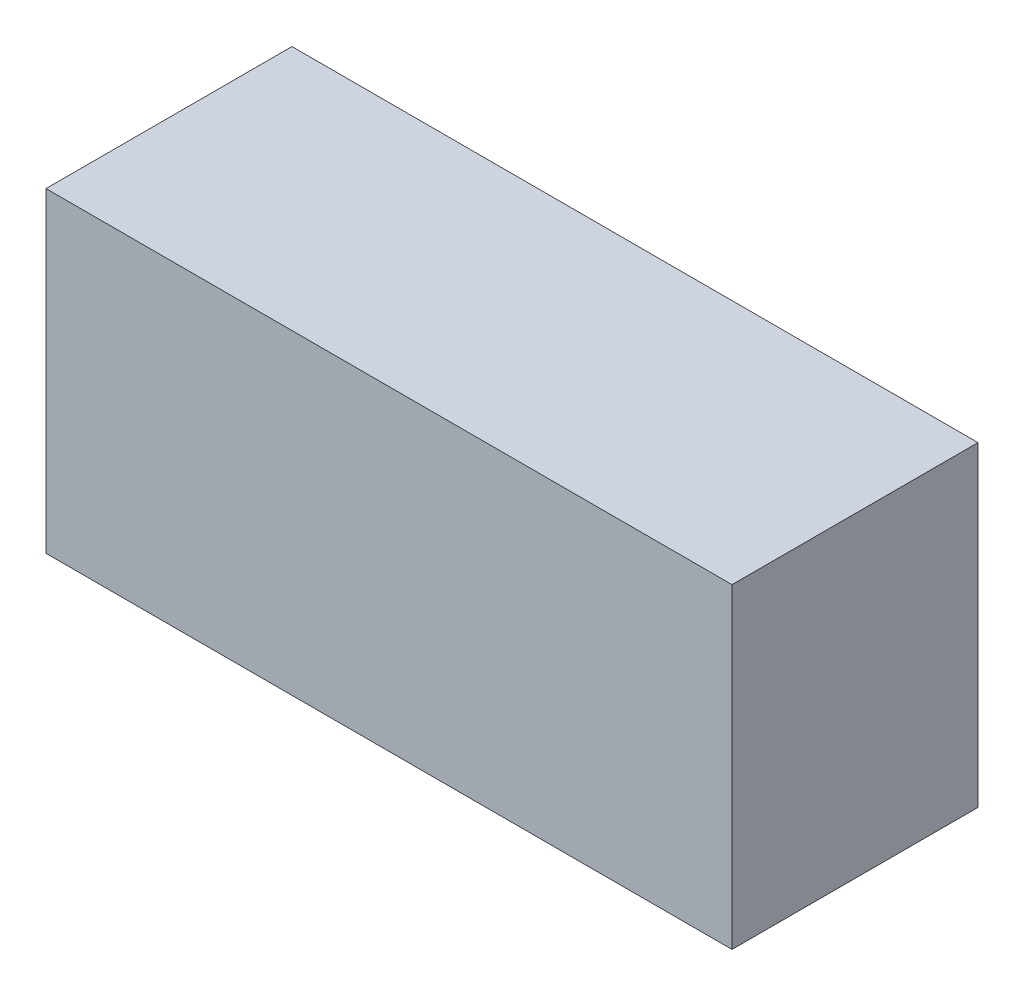
ISO-10303-21;
HEADER;
FILE_DESCRIPTION(('STEP AP214'),'2;1');
FILE_NAME('part.step','',(''),(''),'','','');
FILE_SCHEMA(('AUTOMOTIVE_DESIGN { 1 0 10303 214 1 1 1 1 }'));
ENDSEC;
DATA;
#1=APPLICATION_CONTEXT('core data for automotive mechanical design processes');
#2=APPLICATION_PROTOCOL_DEFINITION('international standard','automotive_design',2000,#1);
#3=PRODUCT_CONTEXT('',#1,'mechanical');
#4=PRODUCT('Part','Part','',(#3));
#5=PRODUCT_RELATED_PRODUCT_CATEGORY('part','',(#4));
#6=PRODUCT_DEFINITION_FORMATION('','',#4);
#7=PRODUCT_DEFINITION_CONTEXT('part definition',#1,'design');
#8=PRODUCT_DEFINITION('design','',#6,#7);
#9=PRODUCT_DEFINITION_SHAPE('','',#8);
#10=(LENGTH_UNIT() NAMED_UNIT(*) SI_UNIT(.MILLI.,.METRE.));
#11=(NAMED_UNIT(*) PLANE_ANGLE_UNIT() SI_UNIT($,.RADIAN.));
#12=(NAMED_UNIT(*) SI_UNIT($,.STERADIAN.) SOLID_ANGLE_UNIT());
#13=UNCERTAINTY_MEASURE_WITH_UNIT(LENGTH_MEASURE(1.E-05),#10,'distance_accuracy_value','');
#14=(GEOMETRIC_REPRESENTATION_CONTEXT(3) GLOBAL_UNCERTAINTY_ASSIGNED_CONTEXT((#13)) GLOBAL_UNIT_ASSIGNED_CONTEXT((#10,
#11,#12)) REPRESENTATION_CONTEXT('',''));
#15=CARTESIAN_POINT('',(0.,0.,0.));
#16=DIRECTION('',(0.,0.,1.));
#17=DIRECTION('',(1.,0.,0.));
#18=AXIS2_PLACEMENT_3D('',#15,#16,#17);
#19=CARTESIAN_POINT('',(-1.5199995,-0.6999986,1.09000036));
#20=DIRECTION('',(0.,0.,-1.));
#21=DIRECTION('',(-1.,0.,0.));
#22=AXIS2_PLACEMENT_3D('',#19,#20,#21);
#23=PLANE('',#22);
#24=DIRECTION('',(0.,1.,0.));
#25=VECTOR('',#24,1.);
#26=CARTESIAN_POINT('',(1.5199995,-0.6999986,1.09000036));
#27=LINE('',#26,#25);
#28=CARTESIAN_POINT('',(1.5199995,-0.6999986,1.09000036));
#29=VERTEX_POINT('',#28);
#30=CARTESIAN_POINT('',(1.5199995,0.70000114,1.09000036));
#31=VERTEX_POINT('',#30);
#32=EDGE_CURVE('E54',#29,#31,#27,.T.);
#33=ORIENTED_EDGE('',*,*,#32,.T.);
#34=DIRECTION('',(1.,0.,0.));
#35=VECTOR('',#34,1.);
#36=CARTESIAN_POINT('',(1.5199995,0.70000114,1.09000036));
#37=LINE('',#36,#35);
#38=CARTESIAN_POINT('',(-1.5199995,0.70000114,1.09000036));
#39=VERTEX_POINT('',#38);
#40=EDGE_CURVE('E56',#31,#39,#37,.F.);
#41=ORIENTED_EDGE('',*,*,#40,.T.);
#42=DIRECTION('',(0.,1.,0.));
#43=VECTOR('',#42,1.);
#44=CARTESIAN_POINT('',(-1.5199995,0.70000114,1.09000036));
#45=LINE('',#44,#43);
#46=CARTESIAN_POINT('',(-1.5199995,-0.6999986,1.09000036));
#47=VERTEX_POINT('',#46);
#48=EDGE_CURVE('E19',#39,#47,#45,.F.);
#49=ORIENTED_EDGE('',*,*,#48,.T.);
#50=DIRECTION('',(1.,0.,0.));
#51=VECTOR('',#50,1.);
#52=CARTESIAN_POINT('',(-1.5199995,-0.6999986,1.09000036));
#53=LINE('',#52,#51);
#54=EDGE_CURVE('E79',#47,#29,#53,.T.);
#55=ORIENTED_EDGE('',*,*,#54,.T.);
#56=EDGE_LOOP('',(#33,#41,#49,#55));
#57=FACE_BOUND('',#56,.T.);
#58=ADVANCED_FACE('F16',(#57),#23,.F.);
#59=CARTESIAN_POINT('',(-1.5199995,0.70000114,0.));
#60=DIRECTION('',(1.,0.,0.));
#61=DIRECTION('',(0.,0.,-1.));
#62=AXIS2_PLACEMENT_3D('',#59,#60,#61);
#63=PLANE('',#62);
#64=DIRECTION('',(0.,0.,1.));
#65=VECTOR('',#64,1.);
#66=CARTESIAN_POINT('',(-1.5199995,-0.6999986,0.));
#67=LINE('',#66,#65);
#68=CARTESIAN_POINT('',(-1.5199995,-0.6999986,0.));
#69=VERTEX_POINT('',#68);
#70=EDGE_CURVE('E67',#69,#47,#67,.T.);
#71=ORIENTED_EDGE('',*,*,#70,.T.);
#72=ORIENTED_EDGE('',*,*,#48,.F.);
#73=DIRECTION('',(0.,0.,-1.));
#74=VECTOR('',#73,1.);
#75=CARTESIAN_POINT('',(-1.5199995,0.70000114,0.));
#76=LINE('',#75,#74);
#77=CARTESIAN_POINT('',(-1.5199995,0.70000114,0.));
#78=VERTEX_POINT('',#77);
#79=EDGE_CURVE('E62',#39,#78,#76,.T.);
#80=ORIENTED_EDGE('',*,*,#79,.T.);
#81=DIRECTION('',(0.,1.,0.));
#82=VECTOR('',#81,1.);
#83=CARTESIAN_POINT('',(-1.5199995,-0.6999986,0.));
#84=LINE('',#83,#82);
#85=EDGE_CURVE('E82',#69,#78,#84,.T.);
#86=ORIENTED_EDGE('',*,*,#85,.F.);
#87=EDGE_LOOP('',(#71,#72,#80,#86));
#88=FACE_BOUND('',#87,.T.);
#89=ADVANCED_FACE('F64',(#88),#63,.F.);
#90=CARTESIAN_POINT('',(1.5199995,0.70000114,0.));
#91=DIRECTION('',(0.,-1.,0.));
#92=DIRECTION('',(0.,0.,-1.));
#93=AXIS2_PLACEMENT_3D('',#90,#91,#92);
#94=PLANE('',#93);
#95=ORIENTED_EDGE('',*,*,#79,.F.);
#96=ORIENTED_EDGE('',*,*,#40,.F.);
#97=DIRECTION('',(0.,0.,1.));
#98=VECTOR('',#97,1.);
#99=CARTESIAN_POINT('',(1.5199995,0.70000114,0.));
#100=LINE('',#99,#98);
#101=CARTESIAN_POINT('',(1.5199995,0.70000114,0.));
#102=VERTEX_POINT('',#101);
#103=EDGE_CURVE('E74',#31,#102,#100,.F.);
#104=ORIENTED_EDGE('',*,*,#103,.T.);
#105=DIRECTION('',(-1.,0.,0.));
#106=VECTOR('',#105,1.);
#107=CARTESIAN_POINT('',(-1.5199995,0.70000114,0.));
#108=LINE('',#107,#106);
#109=EDGE_CURVE('E71',#78,#102,#108,.F.);
#110=ORIENTED_EDGE('',*,*,#109,.F.);
#111=EDGE_LOOP('',(#95,#96,#104,#110));
#112=FACE_BOUND('',#111,.T.);
#113=ADVANCED_FACE('F69',(#112),#94,.F.);
#114=CARTESIAN_POINT('',(1.5199995,-0.6999986,0.));
#115=DIRECTION('',(-1.,0.,0.));
#116=DIRECTION('',(0.,0.,1.));
#117=AXIS2_PLACEMENT_3D('',#114,#115,#116);
#118=PLANE('',#117);
#119=ORIENTED_EDGE('',*,*,#103,.F.);
#120=ORIENTED_EDGE('',*,*,#32,.F.);
#121=DIRECTION('',(0.,0.,1.));
#122=VECTOR('',#121,1.);
#123=CARTESIAN_POINT('',(1.5199995,-0.6999986,0.));
#124=LINE('',#123,#122);
#125=CARTESIAN_POINT('',(1.5199995,-0.6999986,0.));
#126=VERTEX_POINT('',#125);
#127=EDGE_CURVE('E34',#29,#126,#124,.F.);
#128=ORIENTED_EDGE('',*,*,#127,.T.);
#129=DIRECTION('',(0.,1.,0.));
#130=VECTOR('',#129,1.);
#131=CARTESIAN_POINT('',(1.5199995,-0.6999986,0.));
#132=LINE('',#131,#130);
#133=EDGE_CURVE('E25',#102,#126,#132,.F.);
#134=ORIENTED_EDGE('',*,*,#133,.F.);
#135=EDGE_LOOP('',(#119,#120,#128,#134));
#136=FACE_BOUND('',#135,.T.);
#137=ADVANCED_FACE('F88',(#136),#118,.F.);
#138=CARTESIAN_POINT('',(-1.5199995,-0.6999986,0.));
#139=DIRECTION('',(0.,1.,0.));
#140=DIRECTION('',(0.,0.,1.));
#141=AXIS2_PLACEMENT_3D('',#138,#139,#140);
#142=PLANE('',#141);
#143=ORIENTED_EDGE('',*,*,#127,.F.);
#144=ORIENTED_EDGE('',*,*,#54,.F.);
#145=ORIENTED_EDGE('',*,*,#70,.F.);
#146=DIRECTION('',(-1.,0.,0.));
#147=VECTOR('',#146,1.);
#148=CARTESIAN_POINT('',(-1.5199995,-0.6999986,0.));
#149=LINE('',#148,#147);
#150=EDGE_CURVE('E10',#126,#69,#149,.T.);
#151=ORIENTED_EDGE('',*,*,#150,.F.);
#152=EDGE_LOOP('',(#143,#144,#145,#151));
#153=FACE_BOUND('',#152,.T.);
#154=ADVANCED_FACE('F90',(#153),#142,.F.);
#155=CARTESIAN_POINT('',(-1.5199995,-0.6999986,0.));
#156=DIRECTION('',(0.,0.,-1.));
#157=DIRECTION('',(-1.,0.,0.));
#158=AXIS2_PLACEMENT_3D('',#155,#156,#157);
#159=PLANE('',#158);
#160=ORIENTED_EDGE('',*,*,#133,.T.);
#161=ORIENTED_EDGE('',*,*,#150,.T.);
#162=ORIENTED_EDGE('',*,*,#85,.T.);
#163=ORIENTED_EDGE('',*,*,#109,.T.);
#164=EDGE_LOOP('',(#160,#161,#162,#163));
#165=FACE_BOUND('',#164,.T.);
#166=ADVANCED_FACE('F87',(#165),#159,.T.);
#167=CLOSED_SHELL('',(#58,#89,#113,#137,#154,#166));
#168=MANIFOLD_SOLID_BREP('B1',#167);
#169=ADVANCED_BREP_SHAPE_REPRESENTATION('',(#18,#168),#14);
#170=SHAPE_DEFINITION_REPRESENTATION(#9,#169);
ENDSEC;
END-ISO-10303-21;
